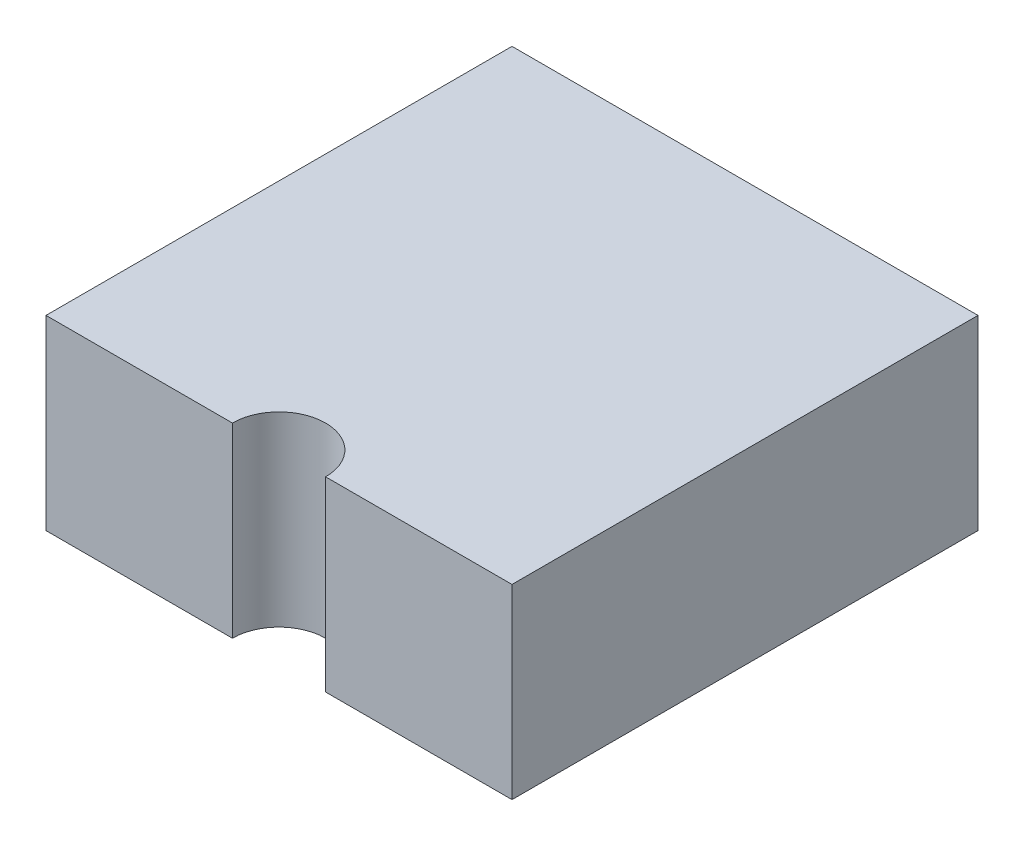
ISO-10303-21;
HEADER;
FILE_DESCRIPTION(('STEP AP214'),'2;1');
FILE_NAME('part.step','',(''),(''),'','','');
FILE_SCHEMA(('AUTOMOTIVE_DESIGN { 1 0 10303 214 1 1 1 1 }'));
ENDSEC;
DATA;
#1=APPLICATION_CONTEXT('core data for automotive mechanical design processes');
#2=APPLICATION_PROTOCOL_DEFINITION('international standard','automotive_design',2000,#1);
#3=PRODUCT_CONTEXT('',#1,'mechanical');
#4=PRODUCT('Part','Part','',(#3));
#5=PRODUCT_RELATED_PRODUCT_CATEGORY('part','',(#4));
#6=PRODUCT_DEFINITION_FORMATION('','',#4);
#7=PRODUCT_DEFINITION_CONTEXT('part definition',#1,'design');
#8=PRODUCT_DEFINITION('design','',#6,#7);
#9=PRODUCT_DEFINITION_SHAPE('','',#8);
#10=(LENGTH_UNIT() NAMED_UNIT(*) SI_UNIT(.MILLI.,.METRE.));
#11=(NAMED_UNIT(*) PLANE_ANGLE_UNIT() SI_UNIT($,.RADIAN.));
#12=(NAMED_UNIT(*) SI_UNIT($,.STERADIAN.) SOLID_ANGLE_UNIT());
#13=UNCERTAINTY_MEASURE_WITH_UNIT(LENGTH_MEASURE(1.E-05),#10,'distance_accuracy_value','');
#14=(GEOMETRIC_REPRESENTATION_CONTEXT(3) GLOBAL_UNCERTAINTY_ASSIGNED_CONTEXT((#13)) GLOBAL_UNIT_ASSIGNED_CONTEXT((#10,
#11,#12)) REPRESENTATION_CONTEXT('',''));
#15=CARTESIAN_POINT('',(0.,0.,0.));
#16=DIRECTION('',(0.,0.,1.));
#17=DIRECTION('',(1.,0.,0.));
#18=AXIS2_PLACEMENT_3D('',#15,#16,#17);
#19=CARTESIAN_POINT('',(25.,20.,-25.));
#20=DIRECTION('',(-1.,0.,0.));
#21=DIRECTION('',(0.,0.,1.));
#22=AXIS2_PLACEMENT_3D('',#19,#20,#21);
#23=PLANE('',#22);
#24=DIRECTION('',(0.,0.,-1.));
#25=VECTOR('',#24,1.);
#26=CARTESIAN_POINT('',(25.,0.,-25.));
#27=LINE('',#26,#25);
#28=CARTESIAN_POINT('',(25.,0.,25.));
#29=VERTEX_POINT('',#28);
#30=CARTESIAN_POINT('',(25.,0.,-25.));
#31=VERTEX_POINT('',#30);
#32=EDGE_CURVE('E128',#29,#31,#27,.T.);
#33=ORIENTED_EDGE('',*,*,#32,.T.);
#34=DIRECTION('',(0.,-1.,0.));
#35=VECTOR('',#34,1.);
#36=CARTESIAN_POINT('',(25.,20.,-25.));
#37=LINE('',#36,#35);
#38=CARTESIAN_POINT('',(25.,20.,-25.));
#39=VERTEX_POINT('',#38);
#40=EDGE_CURVE('E11',#39,#31,#37,.T.);
#41=ORIENTED_EDGE('',*,*,#40,.F.);
#42=DIRECTION('',(0.,0.,-1.));
#43=VECTOR('',#42,1.);
#44=CARTESIAN_POINT('',(25.,20.,-25.));
#45=LINE('',#44,#43);
#46=CARTESIAN_POINT('',(25.,20.,25.));
#47=VERTEX_POINT('',#46);
#48=EDGE_CURVE('E144',#47,#39,#45,.T.);
#49=ORIENTED_EDGE('',*,*,#48,.F.);
#50=DIRECTION('',(0.,-1.,0.));
#51=VECTOR('',#50,1.);
#52=CARTESIAN_POINT('',(25.,20.,25.));
#53=LINE('',#52,#51);
#54=EDGE_CURVE('E124',#47,#29,#53,.T.);
#55=ORIENTED_EDGE('',*,*,#54,.T.);
#56=EDGE_LOOP('',(#33,#41,#49,#55));
#57=FACE_BOUND('',#56,.T.);
#58=ADVANCED_FACE('F39',(#57),#23,.F.);
#59=CARTESIAN_POINT('',(-25.,20.,-25.));
#60=DIRECTION('',(0.,0.,1.));
#61=DIRECTION('',(1.,0.,0.));
#62=AXIS2_PLACEMENT_3D('',#59,#60,#61);
#63=PLANE('',#62);
#64=DIRECTION('',(-1.,0.,0.));
#65=VECTOR('',#64,1.);
#66=CARTESIAN_POINT('',(-25.,0.,-25.));
#67=LINE('',#66,#65);
#68=CARTESIAN_POINT('',(-25.,0.,-25.));
#69=VERTEX_POINT('',#68);
#70=EDGE_CURVE('E132',#31,#69,#67,.T.);
#71=ORIENTED_EDGE('',*,*,#70,.T.);
#72=DIRECTION('',(0.,-1.,0.));
#73=VECTOR('',#72,1.);
#74=CARTESIAN_POINT('',(-25.,20.,-25.));
#75=LINE('',#74,#73);
#76=CARTESIAN_POINT('',(-25.,20.,-25.));
#77=VERTEX_POINT('',#76);
#78=EDGE_CURVE('E48',#77,#69,#75,.T.);
#79=ORIENTED_EDGE('',*,*,#78,.F.);
#80=DIRECTION('',(-1.,0.,0.));
#81=VECTOR('',#80,1.);
#82=CARTESIAN_POINT('',(-25.,20.,-25.));
#83=LINE('',#82,#81);
#84=EDGE_CURVE('E93',#39,#77,#83,.T.);
#85=ORIENTED_EDGE('',*,*,#84,.F.);
#86=ORIENTED_EDGE('',*,*,#40,.T.);
#87=EDGE_LOOP('',(#71,#79,#85,#86));
#88=FACE_BOUND('',#87,.T.);
#89=ADVANCED_FACE('F172',(#88),#63,.F.);
#90=CARTESIAN_POINT('',(-25.,20.,-25.));
#91=DIRECTION('',(1.,0.,0.));
#92=DIRECTION('',(0.,0.,-1.));
#93=AXIS2_PLACEMENT_3D('',#90,#91,#92);
#94=PLANE('',#93);
#95=DIRECTION('',(0.,0.,1.));
#96=VECTOR('',#95,1.);
#97=CARTESIAN_POINT('',(-25.,0.,-25.));
#98=LINE('',#97,#96);
#99=CARTESIAN_POINT('',(-25.,0.,25.));
#100=VERTEX_POINT('',#99);
#101=EDGE_CURVE('E135',#69,#100,#98,.T.);
#102=ORIENTED_EDGE('',*,*,#101,.T.);
#103=DIRECTION('',(0.,-1.,0.));
#104=VECTOR('',#103,1.);
#105=CARTESIAN_POINT('',(-25.,20.,25.));
#106=LINE('',#105,#104);
#107=CARTESIAN_POINT('',(-25.,20.,25.));
#108=VERTEX_POINT('',#107);
#109=EDGE_CURVE('E117',#108,#100,#106,.T.);
#110=ORIENTED_EDGE('',*,*,#109,.F.);
#111=DIRECTION('',(0.,0.,1.));
#112=VECTOR('',#111,1.);
#113=CARTESIAN_POINT('',(-25.,20.,-25.));
#114=LINE('',#113,#112);
#115=EDGE_CURVE('E106',#77,#108,#114,.T.);
#116=ORIENTED_EDGE('',*,*,#115,.F.);
#117=ORIENTED_EDGE('',*,*,#78,.T.);
#118=EDGE_LOOP('',(#102,#110,#116,#117));
#119=FACE_BOUND('',#118,.T.);
#120=ADVANCED_FACE('F154',(#119),#94,.F.);
#121=CARTESIAN_POINT('',(-25.,20.,25.));
#122=DIRECTION('',(0.,0.,-1.));
#123=DIRECTION('',(-1.,0.,0.));
#124=AXIS2_PLACEMENT_3D('',#121,#122,#123);
#125=PLANE('',#124);
#126=DIRECTION('',(1.,0.,0.));
#127=VECTOR('',#126,1.);
#128=CARTESIAN_POINT('',(-25.,0.,25.));
#129=LINE('',#128,#127);
#130=CARTESIAN_POINT('',(-5.,0.,25.));
#131=VERTEX_POINT('',#130);
#132=EDGE_CURVE('E115',#100,#131,#129,.T.);
#133=ORIENTED_EDGE('',*,*,#132,.T.);
#134=DIRECTION('',(0.,-1.,0.));
#135=VECTOR('',#134,1.);
#136=CARTESIAN_POINT('',(-5.,20.,25.));
#137=LINE('',#136,#135);
#138=CARTESIAN_POINT('',(-5.,20.,25.));
#139=VERTEX_POINT('',#138);
#140=EDGE_CURVE('E112',#139,#131,#137,.T.);
#141=ORIENTED_EDGE('',*,*,#140,.F.);
#142=DIRECTION('',(1.,0.,0.));
#143=VECTOR('',#142,1.);
#144=CARTESIAN_POINT('',(-25.,20.,25.));
#145=LINE('',#144,#143);
#146=EDGE_CURVE('E100',#108,#139,#145,.T.);
#147=ORIENTED_EDGE('',*,*,#146,.F.);
#148=ORIENTED_EDGE('',*,*,#109,.T.);
#149=EDGE_LOOP('',(#133,#141,#147,#148));
#150=FACE_BOUND('',#149,.T.);
#151=ADVANCED_FACE('F113',(#150),#125,.F.);
#152=CARTESIAN_POINT('',(0.,20.,25.));
#153=DIRECTION('',(0.,-1.,0.));
#154=DIRECTION('',(0.,0.,-1.));
#155=AXIS2_PLACEMENT_3D('',#152,#153,#154);
#156=CYLINDRICAL_SURFACE('',#155,5.);
#157=CARTESIAN_POINT('',(0.,0.,25.));
#158=DIRECTION('',(0.,-1.,0.));
#159=DIRECTION('',(0.,0.,-1.));
#160=AXIS2_PLACEMENT_3D('',#157,#158,#159);
#161=CIRCLE('',#160,5.);
#162=CARTESIAN_POINT('',(5.,0.,25.));
#163=VERTEX_POINT('',#162);
#164=EDGE_CURVE('E79',#131,#163,#161,.T.);
#165=ORIENTED_EDGE('',*,*,#164,.T.);
#166=DIRECTION('',(0.,-1.,0.));
#167=VECTOR('',#166,1.);
#168=CARTESIAN_POINT('',(5.,20.,25.));
#169=LINE('',#168,#167);
#170=CARTESIAN_POINT('',(5.,20.,25.));
#171=VERTEX_POINT('',#170);
#172=EDGE_CURVE('E118',#171,#163,#169,.T.);
#173=ORIENTED_EDGE('',*,*,#172,.F.);
#174=CARTESIAN_POINT('',(0.,20.,25.));
#175=DIRECTION('',(0.,-1.,0.));
#176=DIRECTION('',(0.,0.,-1.));
#177=AXIS2_PLACEMENT_3D('',#174,#175,#176);
#178=CIRCLE('',#177,5.);
#179=EDGE_CURVE('E104',#139,#171,#178,.T.);
#180=ORIENTED_EDGE('',*,*,#179,.F.);
#181=ORIENTED_EDGE('',*,*,#140,.T.);
#182=EDGE_LOOP('',(#165,#173,#180,#181));
#183=FACE_BOUND('',#182,.T.);
#184=ADVANCED_FACE('F120',(#183),#156,.F.);
#185=CARTESIAN_POINT('',(5.,20.,25.));
#186=DIRECTION('',(0.,0.,-1.));
#187=DIRECTION('',(-1.,0.,0.));
#188=AXIS2_PLACEMENT_3D('',#185,#186,#187);
#189=PLANE('',#188);
#190=DIRECTION('',(1.,0.,0.));
#191=VECTOR('',#190,1.);
#192=CARTESIAN_POINT('',(5.,0.,25.));
#193=LINE('',#192,#191);
#194=EDGE_CURVE('E85',#163,#29,#193,.T.);
#195=ORIENTED_EDGE('',*,*,#194,.T.);
#196=ORIENTED_EDGE('',*,*,#54,.F.);
#197=DIRECTION('',(1.,0.,0.));
#198=VECTOR('',#197,1.);
#199=CARTESIAN_POINT('',(5.,20.,25.));
#200=LINE('',#199,#198);
#201=EDGE_CURVE('E56',#171,#47,#200,.T.);
#202=ORIENTED_EDGE('',*,*,#201,.F.);
#203=ORIENTED_EDGE('',*,*,#172,.T.);
#204=EDGE_LOOP('',(#195,#196,#202,#203));
#205=FACE_BOUND('',#204,.T.);
#206=ADVANCED_FACE('F161',(#205),#189,.F.);
#207=CARTESIAN_POINT('',(0.,20.,25.));
#208=DIRECTION('',(0.,-1.,0.));
#209=DIRECTION('',(0.,0.,-1.));
#210=AXIS2_PLACEMENT_3D('',#207,#208,#209);
#211=PLANE('',#210);
#212=ORIENTED_EDGE('',*,*,#48,.T.);
#213=ORIENTED_EDGE('',*,*,#84,.T.);
#214=ORIENTED_EDGE('',*,*,#115,.T.);
#215=ORIENTED_EDGE('',*,*,#146,.T.);
#216=ORIENTED_EDGE('',*,*,#179,.T.);
#217=ORIENTED_EDGE('',*,*,#201,.T.);
#218=EDGE_LOOP('',(#212,#213,#214,#215,#216,#217));
#219=FACE_BOUND('',#218,.T.);
#220=ADVANCED_FACE('F102',(#219),#211,.F.);
#221=CARTESIAN_POINT('',(0.,0.,25.));
#222=DIRECTION('',(0.,-1.,0.));
#223=DIRECTION('',(0.,0.,-1.));
#224=AXIS2_PLACEMENT_3D('',#221,#222,#223);
#225=PLANE('',#224);
#226=ORIENTED_EDGE('',*,*,#32,.F.);
#227=ORIENTED_EDGE('',*,*,#194,.F.);
#228=ORIENTED_EDGE('',*,*,#164,.F.);
#229=ORIENTED_EDGE('',*,*,#132,.F.);
#230=ORIENTED_EDGE('',*,*,#101,.F.);
#231=ORIENTED_EDGE('',*,*,#70,.F.);
#232=EDGE_LOOP('',(#226,#227,#228,#229,#230,#231));
#233=FACE_BOUND('',#232,.T.);
#234=ADVANCED_FACE('F157',(#233),#225,.T.);
#235=CLOSED_SHELL('',(#58,#89,#120,#151,#184,#206,#220,#234));
#236=MANIFOLD_SOLID_BREP('B2',#235);
#237=ADVANCED_BREP_SHAPE_REPRESENTATION('',(#18,#236),#14);
#238=SHAPE_DEFINITION_REPRESENTATION(#9,#237);
ENDSEC;
END-ISO-10303-21;
